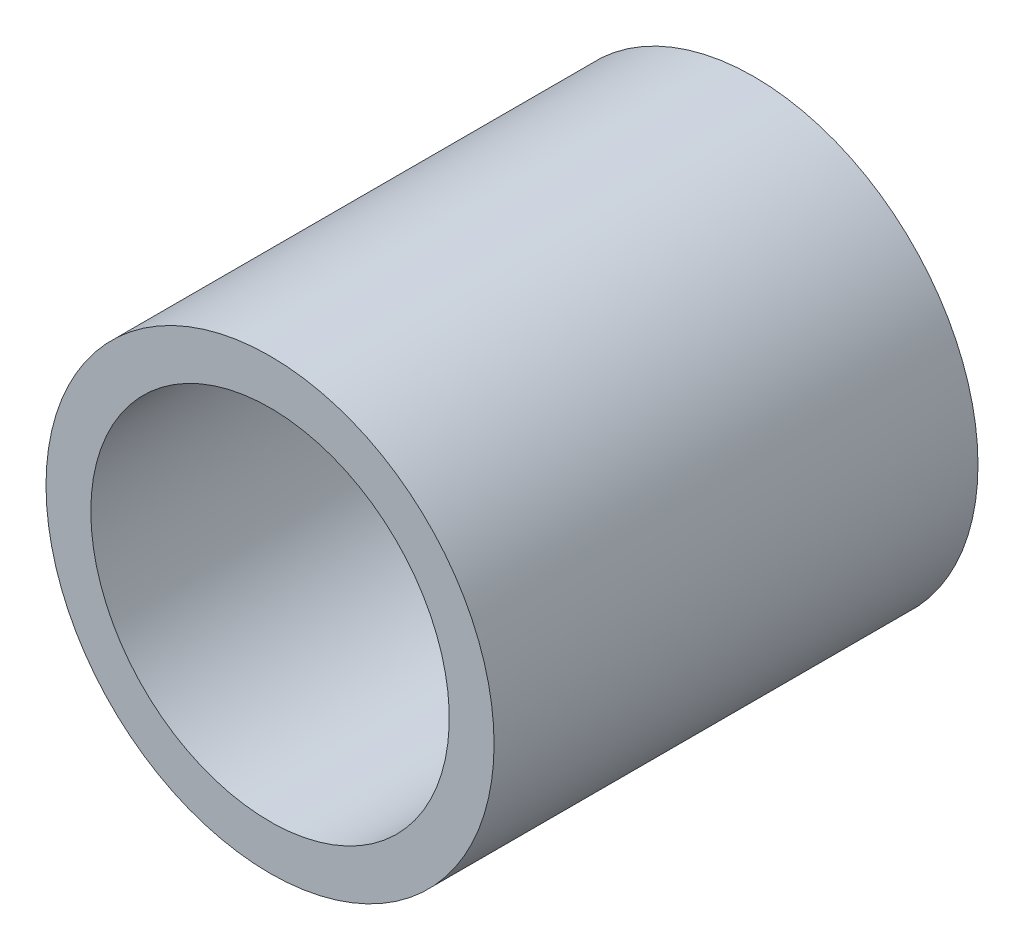
ISO-10303-21;
HEADER;
FILE_DESCRIPTION(('STEP AP214'),'2;1');
FILE_NAME('part.step','',(''),(''),'','','');
FILE_SCHEMA(('AUTOMOTIVE_DESIGN { 1 0 10303 214 1 1 1 1 }'));
ENDSEC;
DATA;
#1=APPLICATION_CONTEXT('core data for automotive mechanical design processes');
#2=APPLICATION_PROTOCOL_DEFINITION('international standard','automotive_design',2000,#1);
#3=PRODUCT_CONTEXT('',#1,'mechanical');
#4=PRODUCT('Part','Part','',(#3));
#5=PRODUCT_RELATED_PRODUCT_CATEGORY('part','',(#4));
#6=PRODUCT_DEFINITION_FORMATION('','',#4);
#7=PRODUCT_DEFINITION_CONTEXT('part definition',#1,'design');
#8=PRODUCT_DEFINITION('design','',#6,#7);
#9=PRODUCT_DEFINITION_SHAPE('','',#8);
#10=(LENGTH_UNIT() NAMED_UNIT(*) SI_UNIT(.MILLI.,.METRE.));
#11=(NAMED_UNIT(*) PLANE_ANGLE_UNIT() SI_UNIT($,.RADIAN.));
#12=(NAMED_UNIT(*) SI_UNIT($,.STERADIAN.) SOLID_ANGLE_UNIT());
#13=UNCERTAINTY_MEASURE_WITH_UNIT(LENGTH_MEASURE(1.E-05),#10,'distance_accuracy_value','');
#14=(GEOMETRIC_REPRESENTATION_CONTEXT(3) GLOBAL_UNCERTAINTY_ASSIGNED_CONTEXT((#13)) GLOBAL_UNIT_ASSIGNED_CONTEXT((#10,
#11,#12)) REPRESENTATION_CONTEXT('',''));
#15=CARTESIAN_POINT('',(0.,0.,0.));
#16=DIRECTION('',(0.,0.,1.));
#17=DIRECTION('',(1.,0.,0.));
#18=AXIS2_PLACEMENT_3D('',#15,#16,#17);
#19=CARTESIAN_POINT('',(0.,0.,10.8));
#20=DIRECTION('',(0.,0.,1.));
#21=DIRECTION('',(1.,0.,0.));
#22=AXIS2_PLACEMENT_3D('',#19,#20,#21);
#23=PLANE('',#22);
#24=CARTESIAN_POINT('',(0.,0.,10.8));
#25=DIRECTION('',(0.,0.,1.));
#26=DIRECTION('',(1.,0.,0.));
#27=AXIS2_PLACEMENT_3D('',#24,#25,#26);
#28=CIRCLE('',#27,5.);
#29=CARTESIAN_POINT('',(-5.,0.,10.8));
#30=VERTEX_POINT('',#29);
#31=EDGE_CURVE('E10',#30,#30,#28,.T.);
#32=ORIENTED_EDGE('',*,*,#31,.T.);
#33=EDGE_LOOP('',(#32));
#34=FACE_BOUND('',#33,.T.);
#35=CARTESIAN_POINT('',(0.,0.,10.8));
#36=DIRECTION('',(0.,0.,1.));
#37=DIRECTION('',(1.,0.,0.));
#38=AXIS2_PLACEMENT_3D('',#35,#36,#37);
#39=CIRCLE('',#38,4.);
#40=CARTESIAN_POINT('',(-4.,0.,10.8));
#41=VERTEX_POINT('',#40);
#42=EDGE_CURVE('E44',#41,#41,#39,.T.);
#43=ORIENTED_EDGE('',*,*,#42,.F.);
#44=EDGE_LOOP('',(#43));
#45=FACE_BOUND('',#44,.T.);
#46=ADVANCED_FACE('F33',(#34,#45),#23,.T.);
#47=CARTESIAN_POINT('',(0.,0.,0.));
#48=DIRECTION('',(0.,0.,1.));
#49=DIRECTION('',(1.,0.,0.));
#50=AXIS2_PLACEMENT_3D('',#47,#48,#49);
#51=PLANE('',#50);
#52=CARTESIAN_POINT('',(0.,0.,0.));
#53=DIRECTION('',(0.,0.,1.));
#54=DIRECTION('',(1.,0.,0.));
#55=AXIS2_PLACEMENT_3D('',#52,#53,#54);
#56=CIRCLE('',#55,5.);
#57=CARTESIAN_POINT('',(-5.,0.,0.));
#58=VERTEX_POINT('',#57);
#59=EDGE_CURVE('E37',#58,#58,#56,.T.);
#60=ORIENTED_EDGE('',*,*,#59,.F.);
#61=EDGE_LOOP('',(#60));
#62=FACE_BOUND('',#61,.T.);
#63=CARTESIAN_POINT('',(0.,0.,0.));
#64=DIRECTION('',(0.,0.,1.));
#65=DIRECTION('',(1.,0.,0.));
#66=AXIS2_PLACEMENT_3D('',#63,#64,#65);
#67=CIRCLE('',#66,4.);
#68=CARTESIAN_POINT('',(-4.,0.,0.));
#69=VERTEX_POINT('',#68);
#70=EDGE_CURVE('E46',#69,#69,#67,.T.);
#71=ORIENTED_EDGE('',*,*,#70,.T.);
#72=EDGE_LOOP('',(#71));
#73=FACE_BOUND('',#72,.T.);
#74=ADVANCED_FACE('F56',(#62,#73),#51,.F.);
#75=CARTESIAN_POINT('',(0.,0.,10.8));
#76=DIRECTION('',(0.,0.,-1.));
#77=DIRECTION('',(-1.,0.,0.));
#78=AXIS2_PLACEMENT_3D('',#75,#76,#77);
#79=CYLINDRICAL_SURFACE('',#78,5.);
#80=CARTESIAN_POINT('',(-5.,0.,10.8));
#81=CARTESIAN_POINT('',(-5.,0.,10.6875));
#82=CARTESIAN_POINT('',(-5.,0.,10.575));
#83=CARTESIAN_POINT('',(-5.,0.,10.35));
#84=CARTESIAN_POINT('',(-5.,0.,10.2375));
#85=CARTESIAN_POINT('',(-5.,0.,10.0125));
#86=CARTESIAN_POINT('',(-5.,0.,9.9));
#87=CARTESIAN_POINT('',(-5.,0.,9.675));
#88=CARTESIAN_POINT('',(-5.,0.,9.5625));
#89=CARTESIAN_POINT('',(-5.,0.,9.3375));
#90=CARTESIAN_POINT('',(-5.,0.,9.225));
#91=CARTESIAN_POINT('',(-5.,0.,9.));
#92=CARTESIAN_POINT('',(-5.,0.,8.8875));
#93=CARTESIAN_POINT('',(-5.,0.,8.6625));
#94=CARTESIAN_POINT('',(-5.,0.,8.55));
#95=CARTESIAN_POINT('',(-5.,0.,8.325));
#96=CARTESIAN_POINT('',(-5.,0.,8.2125));
#97=CARTESIAN_POINT('',(-5.,0.,7.9875));
#98=CARTESIAN_POINT('',(-5.,0.,7.875));
#99=CARTESIAN_POINT('',(-5.,0.,7.65));
#100=CARTESIAN_POINT('',(-5.,0.,7.5375));
#101=CARTESIAN_POINT('',(-5.,0.,7.3125));
#102=CARTESIAN_POINT('',(-5.,0.,7.2));
#103=CARTESIAN_POINT('',(-5.,0.,6.975));
#104=CARTESIAN_POINT('',(-5.,0.,6.8625));
#105=CARTESIAN_POINT('',(-5.,0.,6.6375));
#106=CARTESIAN_POINT('',(-5.,0.,6.525));
#107=CARTESIAN_POINT('',(-5.,0.,6.3));
#108=CARTESIAN_POINT('',(-5.,0.,6.1875));
#109=CARTESIAN_POINT('',(-5.,0.,5.9625));
#110=CARTESIAN_POINT('',(-5.,0.,5.85));
#111=CARTESIAN_POINT('',(-5.,0.,5.625));
#112=CARTESIAN_POINT('',(-5.,0.,5.5125));
#113=CARTESIAN_POINT('',(-5.,0.,5.2875));
#114=CARTESIAN_POINT('',(-5.,0.,5.175));
#115=CARTESIAN_POINT('',(-5.,0.,4.95));
#116=CARTESIAN_POINT('',(-5.,0.,4.8375));
#117=CARTESIAN_POINT('',(-5.,0.,4.6125));
#118=CARTESIAN_POINT('',(-5.,0.,4.5));
#119=CARTESIAN_POINT('',(-5.,0.,4.275));
#120=CARTESIAN_POINT('',(-5.,0.,4.1625));
#121=CARTESIAN_POINT('',(-5.,0.,3.9375));
#122=CARTESIAN_POINT('',(-5.,0.,3.825));
#123=CARTESIAN_POINT('',(-5.,0.,3.6));
#124=CARTESIAN_POINT('',(-5.,0.,3.4875));
#125=CARTESIAN_POINT('',(-5.,0.,3.2625));
#126=CARTESIAN_POINT('',(-5.,0.,3.15));
#127=CARTESIAN_POINT('',(-5.,0.,2.925));
#128=CARTESIAN_POINT('',(-5.,0.,2.8125));
#129=CARTESIAN_POINT('',(-5.,0.,2.5875));
#130=CARTESIAN_POINT('',(-5.,0.,2.475));
#131=CARTESIAN_POINT('',(-5.,0.,2.25));
#132=CARTESIAN_POINT('',(-5.,0.,2.1375));
#133=CARTESIAN_POINT('',(-5.,0.,1.9125));
#134=CARTESIAN_POINT('',(-5.,0.,1.8));
#135=CARTESIAN_POINT('',(-5.,0.,1.575));
#136=CARTESIAN_POINT('',(-5.,0.,1.4625));
#137=CARTESIAN_POINT('',(-5.,0.,1.2375));
#138=CARTESIAN_POINT('',(-5.,0.,1.125));
#139=CARTESIAN_POINT('',(-5.,0.,0.899999999999998));
#140=CARTESIAN_POINT('',(-5.,0.,0.787499999999998));
#141=CARTESIAN_POINT('',(-5.,0.,0.562499999999999));
#142=CARTESIAN_POINT('',(-5.,0.,0.449999999999999));
#143=CARTESIAN_POINT('',(-5.,0.,0.224999999999999));
#144=CARTESIAN_POINT('',(-5.,0.,0.112499999999998));
#145=CARTESIAN_POINT('',(-5.,0.,0.));
#146=B_SPLINE_CURVE_WITH_KNOTS('',3,(#80,#81,#82,#83,#84,#85,#86,#87,#88,#89,#90,#91,#92,#93,
#94,#95,#96,#97,#98,#99,#100,#101,#102,#103,#104,#105,#106,#107,#108,#109,#110,#111,#112,#113,
#114,#115,#116,#117,#118,#119,#120,#121,#122,#123,#124,#125,#126,#127,#128,#129,#130,#131,#132,
#133,#134,#135,#136,#137,#138,#139,#140,#141,#142,#143,#144,#145),.UNSPECIFIED.,.F.,.F.,(4,2,2,
2,2,2,2,2,2,2,2,2,2,2,2,2,2,2,2,2,2,2,2,2,2,2,2,2,2,2,2,2,4),(0.,0.337500000000001,0.675,1.0125,
1.35,1.6875,2.025,2.3625,2.7,3.0375,3.375,3.7125,4.05,4.3875,4.725,5.0625,5.4,5.7375,6.075,
6.4125,6.75,7.0875,7.425,7.7625,8.1,8.4375,8.775,9.1125,9.45,9.7875,10.125,10.4625,10.8),.UNSPECIFIED.);
#147=EDGE_CURVE('BSEAM35',#30,#58,#146,.T.);
#148=ORIENTED_EDGE('',*,*,#31,.F.);
#149=ORIENTED_EDGE('',*,*,#59,.T.);
#150=ORIENTED_EDGE('',*,*,#147,.T.);
#151=ORIENTED_EDGE('',*,*,#147,.F.);
#152=EDGE_LOOP('',(#148,#150,#149,#151));
#153=FACE_BOUND('',#152,.T.);
#154=ADVANCED_FACE('F35',(#153),#79,.T.);
#155=CARTESIAN_POINT('',(0.,0.,10.8));
#156=DIRECTION('',(0.,0.,-1.));
#157=DIRECTION('',(-1.,0.,0.));
#158=AXIS2_PLACEMENT_3D('',#155,#156,#157);
#159=CYLINDRICAL_SURFACE('',#158,4.);
#160=CARTESIAN_POINT('',(-4.,0.,10.8));
#161=CARTESIAN_POINT('',(-4.,0.,10.6875));
#162=CARTESIAN_POINT('',(-4.,0.,10.575));
#163=CARTESIAN_POINT('',(-4.,0.,10.35));
#164=CARTESIAN_POINT('',(-4.,0.,10.2375));
#165=CARTESIAN_POINT('',(-4.,0.,10.0125));
#166=CARTESIAN_POINT('',(-4.,0.,9.9));
#167=CARTESIAN_POINT('',(-4.,0.,9.675));
#168=CARTESIAN_POINT('',(-4.,0.,9.5625));
#169=CARTESIAN_POINT('',(-4.,0.,9.3375));
#170=CARTESIAN_POINT('',(-4.,0.,9.225));
#171=CARTESIAN_POINT('',(-4.,0.,9.));
#172=CARTESIAN_POINT('',(-4.,0.,8.8875));
#173=CARTESIAN_POINT('',(-4.,0.,8.6625));
#174=CARTESIAN_POINT('',(-4.,0.,8.55));
#175=CARTESIAN_POINT('',(-4.,0.,8.325));
#176=CARTESIAN_POINT('',(-4.,0.,8.2125));
#177=CARTESIAN_POINT('',(-4.,0.,7.9875));
#178=CARTESIAN_POINT('',(-4.,0.,7.875));
#179=CARTESIAN_POINT('',(-4.,0.,7.65));
#180=CARTESIAN_POINT('',(-4.,0.,7.5375));
#181=CARTESIAN_POINT('',(-4.,0.,7.3125));
#182=CARTESIAN_POINT('',(-4.,0.,7.2));
#183=CARTESIAN_POINT('',(-4.,0.,6.975));
#184=CARTESIAN_POINT('',(-4.,0.,6.8625));
#185=CARTESIAN_POINT('',(-4.,0.,6.6375));
#186=CARTESIAN_POINT('',(-4.,0.,6.525));
#187=CARTESIAN_POINT('',(-4.,0.,6.3));
#188=CARTESIAN_POINT('',(-4.,0.,6.1875));
#189=CARTESIAN_POINT('',(-4.,0.,5.9625));
#190=CARTESIAN_POINT('',(-4.,0.,5.85));
#191=CARTESIAN_POINT('',(-4.,0.,5.625));
#192=CARTESIAN_POINT('',(-4.,0.,5.5125));
#193=CARTESIAN_POINT('',(-4.,0.,5.2875));
#194=CARTESIAN_POINT('',(-4.,0.,5.175));
#195=CARTESIAN_POINT('',(-4.,0.,4.95));
#196=CARTESIAN_POINT('',(-4.,0.,4.8375));
#197=CARTESIAN_POINT('',(-4.,0.,4.6125));
#198=CARTESIAN_POINT('',(-4.,0.,4.5));
#199=CARTESIAN_POINT('',(-4.,0.,4.275));
#200=CARTESIAN_POINT('',(-4.,0.,4.1625));
#201=CARTESIAN_POINT('',(-4.,0.,3.9375));
#202=CARTESIAN_POINT('',(-4.,0.,3.825));
#203=CARTESIAN_POINT('',(-4.,0.,3.6));
#204=CARTESIAN_POINT('',(-4.,0.,3.4875));
#205=CARTESIAN_POINT('',(-4.,0.,3.2625));
#206=CARTESIAN_POINT('',(-4.,0.,3.15));
#207=CARTESIAN_POINT('',(-4.,0.,2.925));
#208=CARTESIAN_POINT('',(-4.,0.,2.8125));
#209=CARTESIAN_POINT('',(-4.,0.,2.5875));
#210=CARTESIAN_POINT('',(-4.,0.,2.475));
#211=CARTESIAN_POINT('',(-4.,0.,2.25));
#212=CARTESIAN_POINT('',(-4.,0.,2.1375));
#213=CARTESIAN_POINT('',(-4.,0.,1.9125));
#214=CARTESIAN_POINT('',(-4.,0.,1.8));
#215=CARTESIAN_POINT('',(-4.,0.,1.575));
#216=CARTESIAN_POINT('',(-4.,0.,1.4625));
#217=CARTESIAN_POINT('',(-4.,0.,1.2375));
#218=CARTESIAN_POINT('',(-4.,0.,1.125));
#219=CARTESIAN_POINT('',(-4.,0.,0.899999999999998));
#220=CARTESIAN_POINT('',(-4.,0.,0.787499999999998));
#221=CARTESIAN_POINT('',(-4.,0.,0.562499999999998));
#222=CARTESIAN_POINT('',(-4.,0.,0.449999999999998));
#223=CARTESIAN_POINT('',(-4.,0.,0.224999999999998));
#224=CARTESIAN_POINT('',(-4.,0.,0.112499999999998));
#225=CARTESIAN_POINT('',(-4.,0.,0.));
#226=B_SPLINE_CURVE_WITH_KNOTS('',3,(#160,#161,#162,#163,#164,#165,#166,#167,#168,#169,#170,
#171,#172,#173,#174,#175,#176,#177,#178,#179,#180,#181,#182,#183,#184,#185,#186,#187,#188,#189,
#190,#191,#192,#193,#194,#195,#196,#197,#198,#199,#200,#201,#202,#203,#204,#205,#206,#207,#208,
#209,#210,#211,#212,#213,#214,#215,#216,#217,#218,#219,#220,#221,#222,#223,#224,#225),
.UNSPECIFIED.,.F.,.F.,(4,2,2,2,2,2,2,2,2,2,2,2,2,2,2,2,2,2,2,2,2,2,2,2,2,2,2,2,2,2,2,2,4),(0.,
0.337499999999999,0.674999999999998,1.0125,1.35,1.6875,2.025,2.3625,2.7,3.0375,3.375,3.7125,
4.05,4.3875,4.725,5.0625,5.4,5.7375,6.075,6.4125,6.75,7.0875,7.425,7.7625,8.1,8.4375,8.775,
9.1125,9.45,9.7875,10.125,10.4625,10.8),.UNSPECIFIED.);
#227=EDGE_CURVE('BSEAM52',#41,#69,#226,.T.);
#228=ORIENTED_EDGE('',*,*,#42,.T.);
#229=ORIENTED_EDGE('',*,*,#70,.F.);
#230=ORIENTED_EDGE('',*,*,#227,.T.);
#231=ORIENTED_EDGE('',*,*,#227,.F.);
#232=EDGE_LOOP('',(#228,#230,#229,#231));
#233=FACE_BOUND('',#232,.T.);
#234=ADVANCED_FACE('F52',(#233),#159,.F.);
#235=CLOSED_SHELL('',(#46,#74,#154,#234));
#236=MANIFOLD_SOLID_BREP('B2',#235);
#237=ADVANCED_BREP_SHAPE_REPRESENTATION('',(#18,#236),#14);
#238=SHAPE_DEFINITION_REPRESENTATION(#9,#237);
ENDSEC;
END-ISO-10303-21;
